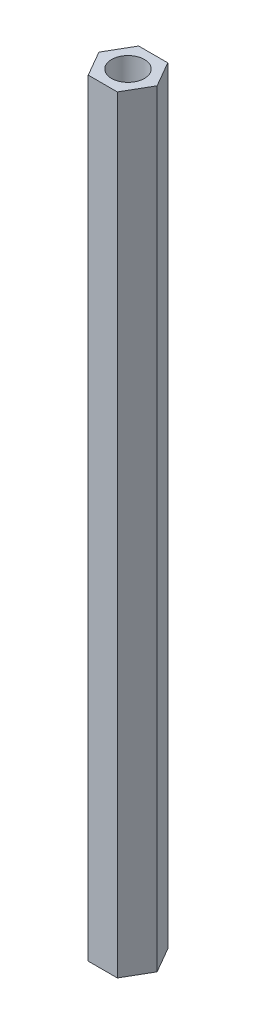
ISO-10303-21;
HEADER;
FILE_DESCRIPTION(('STEP AP214'),'2;1');
FILE_NAME('part.step','',(''),(''),'','','');
FILE_SCHEMA(('AUTOMOTIVE_DESIGN { 1 0 10303 214 1 1 1 1 }'));
ENDSEC;
DATA;
#1=APPLICATION_CONTEXT('core data for automotive mechanical design processes');
#2=APPLICATION_PROTOCOL_DEFINITION('international standard','automotive_design',2000,#1);
#3=PRODUCT_CONTEXT('',#1,'mechanical');
#4=PRODUCT('Part','Part','',(#3));
#5=PRODUCT_RELATED_PRODUCT_CATEGORY('part','',(#4));
#6=PRODUCT_DEFINITION_FORMATION('','',#4);
#7=PRODUCT_DEFINITION_CONTEXT('part definition',#1,'design');
#8=PRODUCT_DEFINITION('design','',#6,#7);
#9=PRODUCT_DEFINITION_SHAPE('','',#8);
#10=(LENGTH_UNIT() NAMED_UNIT(*) SI_UNIT(.MILLI.,.METRE.));
#11=(NAMED_UNIT(*) PLANE_ANGLE_UNIT() SI_UNIT($,.RADIAN.));
#12=(NAMED_UNIT(*) SI_UNIT($,.STERADIAN.) SOLID_ANGLE_UNIT());
#13=UNCERTAINTY_MEASURE_WITH_UNIT(LENGTH_MEASURE(1.E-05),#10,'distance_accuracy_value','');
#14=(GEOMETRIC_REPRESENTATION_CONTEXT(3) GLOBAL_UNCERTAINTY_ASSIGNED_CONTEXT((#13)) GLOBAL_UNIT_ASSIGNED_CONTEXT((#10,
#11,#12)) REPRESENTATION_CONTEXT('',''));
#15=CARTESIAN_POINT('',(0.,0.,0.));
#16=DIRECTION('',(0.,0.,1.));
#17=DIRECTION('',(1.,0.,0.));
#18=AXIS2_PLACEMENT_3D('',#15,#16,#17);
#19=CARTESIAN_POINT('',(0.,70.,0.));
#20=DIRECTION('',(0.,1.,0.));
#21=DIRECTION('',(0.,0.,1.));
#22=AXIS2_PLACEMENT_3D('',#19,#20,#21);
#23=PLANE('',#22);
#24=DIRECTION('',(0.5,0.,-0.866025403784439));
#25=VECTOR('',#24,1.);
#26=CARTESIAN_POINT('',(1.32790561913614,70.,2.3));
#27=LINE('',#26,#25);
#28=CARTESIAN_POINT('',(1.32790561913614,70.,2.3));
#29=VERTEX_POINT('',#28);
#30=CARTESIAN_POINT('',(2.65581123827228,70.,0.));
#31=VERTEX_POINT('',#30);
#32=EDGE_CURVE('E137',#29,#31,#27,.T.);
#33=ORIENTED_EDGE('',*,*,#32,.T.);
#34=DIRECTION('',(-0.5,0.,-0.866025403784438));
#35=VECTOR('',#34,1.);
#36=CARTESIAN_POINT('',(2.65581123827228,70.,0.));
#37=LINE('',#36,#35);
#38=CARTESIAN_POINT('',(1.32790561913614,70.,-2.3));
#39=VERTEX_POINT('',#38);
#40=EDGE_CURVE('E95',#31,#39,#37,.T.);
#41=ORIENTED_EDGE('',*,*,#40,.T.);
#42=DIRECTION('',(-1.,0.,0.));
#43=VECTOR('',#42,1.);
#44=CARTESIAN_POINT('',(1.32790561913614,70.,-2.3));
#45=LINE('',#44,#43);
#46=CARTESIAN_POINT('',(-1.32790561913614,70.,-2.3));
#47=VERTEX_POINT('',#46);
#48=EDGE_CURVE('E108',#39,#47,#45,.T.);
#49=ORIENTED_EDGE('',*,*,#48,.T.);
#50=DIRECTION('',(-0.5,0.,0.866025403784439));
#51=VECTOR('',#50,1.);
#52=CARTESIAN_POINT('',(-1.32790561913614,70.,-2.3));
#53=LINE('',#52,#51);
#54=CARTESIAN_POINT('',(-2.65581123827228,70.,0.));
#55=VERTEX_POINT('',#54);
#56=EDGE_CURVE('E102',#47,#55,#53,.T.);
#57=ORIENTED_EDGE('',*,*,#56,.T.);
#58=DIRECTION('',(0.5,0.,0.866025403784438));
#59=VECTOR('',#58,1.);
#60=CARTESIAN_POINT('',(-2.65581123827228,70.,0.));
#61=LINE('',#60,#59);
#62=CARTESIAN_POINT('',(-1.32790561913614,70.,2.3));
#63=VERTEX_POINT('',#62);
#64=EDGE_CURVE('E106',#55,#63,#61,.T.);
#65=ORIENTED_EDGE('',*,*,#64,.T.);
#66=DIRECTION('',(1.,0.,0.));
#67=VECTOR('',#66,1.);
#68=CARTESIAN_POINT('',(-1.32790561913614,70.,2.3));
#69=LINE('',#68,#67);
#70=EDGE_CURVE('E58',#63,#29,#69,.T.);
#71=ORIENTED_EDGE('',*,*,#70,.T.);
#72=EDGE_LOOP('',(#33,#41,#49,#57,#65,#71));
#73=FACE_BOUND('',#72,.T.);
#74=CARTESIAN_POINT('',(0.,70.,0.));
#75=DIRECTION('',(0.,1.,0.));
#76=DIRECTION('',(0.,0.,1.));
#77=AXIS2_PLACEMENT_3D('',#74,#75,#76);
#78=CIRCLE('',#77,1.5);
#79=CARTESIAN_POINT('',(0.,70.,1.5));
#80=VERTEX_POINT('',#79);
#81=EDGE_CURVE('E130',#80,#80,#78,.T.);
#82=ORIENTED_EDGE('',*,*,#81,.F.);
#83=EDGE_LOOP('',(#82));
#84=FACE_BOUND('',#83,.T.);
#85=ADVANCED_FACE('F41',(#73,#84),#23,.T.);
#86=CARTESIAN_POINT('',(0.,0.,0.));
#87=DIRECTION('',(0.,1.,0.));
#88=DIRECTION('',(0.,0.,1.));
#89=AXIS2_PLACEMENT_3D('',#86,#87,#88);
#90=PLANE('',#89);
#91=DIRECTION('',(0.5,0.,-0.866025403784439));
#92=VECTOR('',#91,1.);
#93=CARTESIAN_POINT('',(1.32790561913614,0.,2.3));
#94=LINE('',#93,#92);
#95=CARTESIAN_POINT('',(1.32790561913614,0.,2.3));
#96=VERTEX_POINT('',#95);
#97=CARTESIAN_POINT('',(2.65581123827228,0.,0.));
#98=VERTEX_POINT('',#97);
#99=EDGE_CURVE('E126',#96,#98,#94,.T.);
#100=ORIENTED_EDGE('',*,*,#99,.F.);
#101=DIRECTION('',(1.,0.,0.));
#102=VECTOR('',#101,1.);
#103=CARTESIAN_POINT('',(-1.32790561913614,0.,2.3));
#104=LINE('',#103,#102);
#105=CARTESIAN_POINT('',(-1.32790561913614,0.,2.3));
#106=VERTEX_POINT('',#105);
#107=EDGE_CURVE('E87',#106,#96,#104,.T.);
#108=ORIENTED_EDGE('',*,*,#107,.F.);
#109=DIRECTION('',(0.5,0.,0.866025403784438));
#110=VECTOR('',#109,1.);
#111=CARTESIAN_POINT('',(-2.65581123827228,0.,0.));
#112=LINE('',#111,#110);
#113=CARTESIAN_POINT('',(-2.65581123827228,0.,0.));
#114=VERTEX_POINT('',#113);
#115=EDGE_CURVE('E81',#114,#106,#112,.T.);
#116=ORIENTED_EDGE('',*,*,#115,.F.);
#117=DIRECTION('',(-0.5,0.,0.866025403784439));
#118=VECTOR('',#117,1.);
#119=CARTESIAN_POINT('',(-1.32790561913614,0.,-2.3));
#120=LINE('',#119,#118);
#121=CARTESIAN_POINT('',(-1.32790561913614,0.,-2.3));
#122=VERTEX_POINT('',#121);
#123=EDGE_CURVE('E116',#122,#114,#120,.T.);
#124=ORIENTED_EDGE('',*,*,#123,.F.);
#125=DIRECTION('',(-1.,0.,0.));
#126=VECTOR('',#125,1.);
#127=CARTESIAN_POINT('',(1.32790561913614,0.,-2.3));
#128=LINE('',#127,#126);
#129=CARTESIAN_POINT('',(1.32790561913614,0.,-2.3));
#130=VERTEX_POINT('',#129);
#131=EDGE_CURVE('E132',#130,#122,#128,.T.);
#132=ORIENTED_EDGE('',*,*,#131,.F.);
#133=DIRECTION('',(-0.5,0.,-0.866025403784438));
#134=VECTOR('',#133,1.);
#135=CARTESIAN_POINT('',(2.65581123827228,0.,0.));
#136=LINE('',#135,#134);
#137=EDGE_CURVE('E129',#98,#130,#136,.T.);
#138=ORIENTED_EDGE('',*,*,#137,.F.);
#139=EDGE_LOOP('',(#100,#108,#116,#124,#132,#138));
#140=FACE_BOUND('',#139,.T.);
#141=CARTESIAN_POINT('',(0.,0.,0.));
#142=DIRECTION('',(0.,1.,0.));
#143=DIRECTION('',(0.,0.,1.));
#144=AXIS2_PLACEMENT_3D('',#141,#142,#143);
#145=CIRCLE('',#144,1.5);
#146=CARTESIAN_POINT('',(0.,0.,1.5));
#147=VERTEX_POINT('',#146);
#148=EDGE_CURVE('E230',#147,#147,#145,.T.);
#149=ORIENTED_EDGE('',*,*,#148,.T.);
#150=EDGE_LOOP('',(#149));
#151=FACE_BOUND('',#150,.T.);
#152=ADVANCED_FACE('F146',(#140,#151),#90,.F.);
#153=CARTESIAN_POINT('',(1.32790561913614,70.,2.3));
#154=DIRECTION('',(-0.866025403784439,0.,-0.5));
#155=DIRECTION('',(-0.5,0.,0.866025403784439));
#156=AXIS2_PLACEMENT_3D('',#153,#154,#155);
#157=PLANE('',#156);
#158=ORIENTED_EDGE('',*,*,#99,.T.);
#159=DIRECTION('',(0.,-1.,0.));
#160=VECTOR('',#159,1.);
#161=CARTESIAN_POINT('',(2.65581123827228,70.,0.));
#162=LINE('',#161,#160);
#163=EDGE_CURVE('E11',#31,#98,#162,.T.);
#164=ORIENTED_EDGE('',*,*,#163,.F.);
#165=ORIENTED_EDGE('',*,*,#32,.F.);
#166=DIRECTION('',(0.,-1.,0.));
#167=VECTOR('',#166,1.);
#168=CARTESIAN_POINT('',(1.32790561913614,70.,2.3));
#169=LINE('',#168,#167);
#170=EDGE_CURVE('E122',#29,#96,#169,.T.);
#171=ORIENTED_EDGE('',*,*,#170,.T.);
#172=EDGE_LOOP('',(#158,#164,#165,#171));
#173=FACE_BOUND('',#172,.T.);
#174=ADVANCED_FACE('F43',(#173),#157,.F.);
#175=CARTESIAN_POINT('',(2.65581123827228,70.,0.));
#176=DIRECTION('',(-0.866025403784439,0.,0.5));
#177=DIRECTION('',(0.5,0.,0.866025403784439));
#178=AXIS2_PLACEMENT_3D('',#175,#176,#177);
#179=PLANE('',#178);
#180=ORIENTED_EDGE('',*,*,#137,.T.);
#181=DIRECTION('',(0.,-1.,0.));
#182=VECTOR('',#181,1.);
#183=CARTESIAN_POINT('',(1.32790561913614,70.,-2.3));
#184=LINE('',#183,#182);
#185=EDGE_CURVE('E50',#39,#130,#184,.T.);
#186=ORIENTED_EDGE('',*,*,#185,.F.);
#187=ORIENTED_EDGE('',*,*,#40,.F.);
#188=ORIENTED_EDGE('',*,*,#163,.T.);
#189=EDGE_LOOP('',(#180,#186,#187,#188));
#190=FACE_BOUND('',#189,.T.);
#191=ADVANCED_FACE('F171',(#190),#179,.F.);
#192=CARTESIAN_POINT('',(1.32790561913614,70.,-2.3));
#193=DIRECTION('',(0.,0.,1.));
#194=DIRECTION('',(1.,0.,0.));
#195=AXIS2_PLACEMENT_3D('',#192,#193,#194);
#196=PLANE('',#195);
#197=ORIENTED_EDGE('',*,*,#131,.T.);
#198=DIRECTION('',(0.,-1.,0.));
#199=VECTOR('',#198,1.);
#200=CARTESIAN_POINT('',(-1.32790561913614,70.,-2.3));
#201=LINE('',#200,#199);
#202=EDGE_CURVE('E117',#47,#122,#201,.T.);
#203=ORIENTED_EDGE('',*,*,#202,.F.);
#204=ORIENTED_EDGE('',*,*,#48,.F.);
#205=ORIENTED_EDGE('',*,*,#185,.T.);
#206=EDGE_LOOP('',(#197,#203,#204,#205));
#207=FACE_BOUND('',#206,.T.);
#208=ADVANCED_FACE('F143',(#207),#196,.F.);
#209=CARTESIAN_POINT('',(-1.32790561913614,70.,-2.3));
#210=DIRECTION('',(0.866025403784439,0.,0.5));
#211=DIRECTION('',(0.5,0.,-0.866025403784439));
#212=AXIS2_PLACEMENT_3D('',#209,#210,#211);
#213=PLANE('',#212);
#214=ORIENTED_EDGE('',*,*,#123,.T.);
#215=DIRECTION('',(0.,-1.,0.));
#216=VECTOR('',#215,1.);
#217=CARTESIAN_POINT('',(-2.65581123827228,70.,0.));
#218=LINE('',#217,#216);
#219=EDGE_CURVE('E113',#55,#114,#218,.T.);
#220=ORIENTED_EDGE('',*,*,#219,.F.);
#221=ORIENTED_EDGE('',*,*,#56,.F.);
#222=ORIENTED_EDGE('',*,*,#202,.T.);
#223=EDGE_LOOP('',(#214,#220,#221,#222));
#224=FACE_BOUND('',#223,.T.);
#225=ADVANCED_FACE('F114',(#224),#213,.F.);
#226=CARTESIAN_POINT('',(-2.65581123827228,70.,0.));
#227=DIRECTION('',(0.866025403784439,0.,-0.5));
#228=DIRECTION('',(-0.5,0.,-0.866025403784439));
#229=AXIS2_PLACEMENT_3D('',#226,#227,#228);
#230=PLANE('',#229);
#231=ORIENTED_EDGE('',*,*,#115,.T.);
#232=DIRECTION('',(0.,-1.,0.));
#233=VECTOR('',#232,1.);
#234=CARTESIAN_POINT('',(-1.32790561913614,70.,2.3));
#235=LINE('',#234,#233);
#236=EDGE_CURVE('E118',#63,#106,#235,.T.);
#237=ORIENTED_EDGE('',*,*,#236,.F.);
#238=ORIENTED_EDGE('',*,*,#64,.F.);
#239=ORIENTED_EDGE('',*,*,#219,.T.);
#240=EDGE_LOOP('',(#231,#237,#238,#239));
#241=FACE_BOUND('',#240,.T.);
#242=ADVANCED_FACE('F120',(#241),#230,.F.);
#243=CARTESIAN_POINT('',(-1.32790561913614,70.,2.3));
#244=DIRECTION('',(0.,0.,-1.));
#245=DIRECTION('',(-1.,0.,0.));
#246=AXIS2_PLACEMENT_3D('',#243,#244,#245);
#247=PLANE('',#246);
#248=ORIENTED_EDGE('',*,*,#107,.T.);
#249=ORIENTED_EDGE('',*,*,#170,.F.);
#250=ORIENTED_EDGE('',*,*,#70,.F.);
#251=ORIENTED_EDGE('',*,*,#236,.T.);
#252=EDGE_LOOP('',(#248,#249,#250,#251));
#253=FACE_BOUND('',#252,.T.);
#254=ADVANCED_FACE('F151',(#253),#247,.F.);
#255=CARTESIAN_POINT('',(0.,70.,0.));
#256=DIRECTION('',(0.,-1.,0.));
#257=DIRECTION('',(0.,0.,-1.));
#258=AXIS2_PLACEMENT_3D('',#255,#256,#257);
#259=CYLINDRICAL_SURFACE('',#258,1.5);
#260=ORIENTED_EDGE('',*,*,#81,.T.);
#261=EDGE_LOOP('',(#260));
#262=FACE_BOUND('',#261,.T.);
#263=ORIENTED_EDGE('',*,*,#148,.F.);
#264=EDGE_LOOP('',(#263));
#265=FACE_BOUND('',#264,.T.);
#266=ADVANCED_FACE('F153',(#262,#265),#259,.F.);
#267=CLOSED_SHELL('',(#85,#152,#174,#191,#208,#225,#242,#254,#266));
#268=MANIFOLD_SOLID_BREP('B2',#267);
#269=ADVANCED_BREP_SHAPE_REPRESENTATION('',(#18,#268),#14);
#270=SHAPE_DEFINITION_REPRESENTATION(#9,#269);
ENDSEC;
END-ISO-10303-21;
